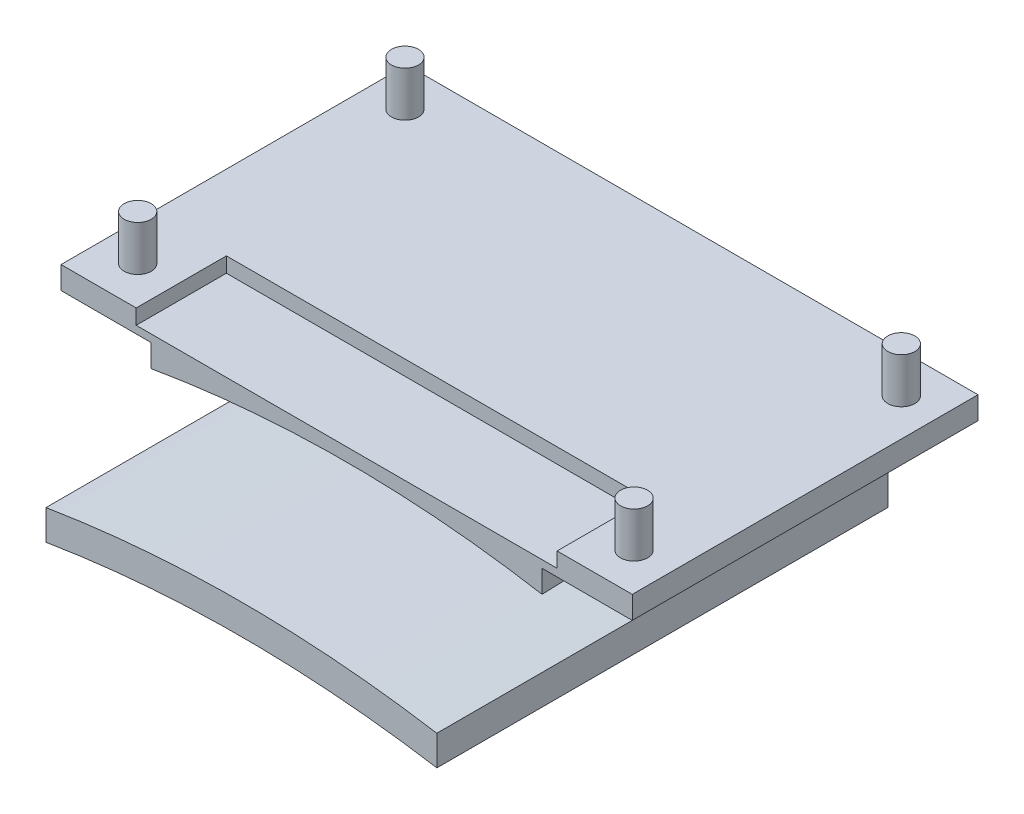
ISO-10303-21;
HEADER;
FILE_DESCRIPTION(('STEP AP214'),'2;1');
FILE_NAME('part.step','',(''),(''),'','','');
FILE_SCHEMA(('AUTOMOTIVE_DESIGN { 1 0 10303 214 1 1 1 1 }'));
ENDSEC;
DATA;
#1=APPLICATION_CONTEXT('core data for automotive mechanical design processes');
#2=APPLICATION_PROTOCOL_DEFINITION('international standard','automotive_design',2000,#1);
#3=PRODUCT_CONTEXT('',#1,'mechanical');
#4=PRODUCT('Part','Part','',(#3));
#5=PRODUCT_RELATED_PRODUCT_CATEGORY('part','',(#4));
#6=PRODUCT_DEFINITION_FORMATION('','',#4);
#7=PRODUCT_DEFINITION_CONTEXT('part definition',#1,'design');
#8=PRODUCT_DEFINITION('design','',#6,#7);
#9=PRODUCT_DEFINITION_SHAPE('','',#8);
#10=(LENGTH_UNIT() NAMED_UNIT(*) SI_UNIT(.MILLI.,.METRE.));
#11=(NAMED_UNIT(*) PLANE_ANGLE_UNIT() SI_UNIT($,.RADIAN.));
#12=(NAMED_UNIT(*) SI_UNIT($,.STERADIAN.) SOLID_ANGLE_UNIT());
#13=UNCERTAINTY_MEASURE_WITH_UNIT(LENGTH_MEASURE(1.E-05),#10,'distance_accuracy_value','');
#14=(GEOMETRIC_REPRESENTATION_CONTEXT(3) GLOBAL_UNCERTAINTY_ASSIGNED_CONTEXT((#13)) GLOBAL_UNIT_ASSIGNED_CONTEXT((#10,
#11,#12)) REPRESENTATION_CONTEXT('',''));
#15=CARTESIAN_POINT('',(0.,0.,0.));
#16=DIRECTION('',(0.,0.,1.));
#17=DIRECTION('',(1.,0.,0.));
#18=AXIS2_PLACEMENT_3D('',#15,#16,#17);
#19=CARTESIAN_POINT('',(-13.,9.5,8.));
#20=DIRECTION('',(0.,0.,-1.));
#21=DIRECTION('',(-1.,0.,0.));
#22=AXIS2_PLACEMENT_3D('',#19,#20,#21);
#23=PLANE('',#22);
#24=DIRECTION('',(0.,1.,0.));
#25=VECTOR('',#24,1.);
#26=CARTESIAN_POINT('',(-14.,8.5,8.));
#27=LINE('',#26,#25);
#28=CARTESIAN_POINT('',(-14.,8.5,8.));
#29=VERTEX_POINT('',#28);
#30=CARTESIAN_POINT('',(-14.,9.5,8.));
#31=VERTEX_POINT('',#30);
#32=EDGE_CURVE('E275',#29,#31,#27,.T.);
#33=ORIENTED_EDGE('',*,*,#32,.T.);
#34=DIRECTION('',(1.,0.,0.));
#35=VECTOR('',#34,1.);
#36=CARTESIAN_POINT('',(-13.,9.5,8.));
#37=LINE('',#36,#35);
#38=CARTESIAN_POINT('',(-19.,9.5,8.));
#39=VERTEX_POINT('',#38);
#40=EDGE_CURVE('E199',#39,#31,#37,.T.);
#41=ORIENTED_EDGE('',*,*,#40,.F.);
#42=DIRECTION('',(0.,1.,0.));
#43=VECTOR('',#42,1.);
#44=CARTESIAN_POINT('',(-19.,9.5,8.));
#45=LINE('',#44,#43);
#46=CARTESIAN_POINT('',(-19.,8.,8.));
#47=VERTEX_POINT('',#46);
#48=EDGE_CURVE('E332',#47,#39,#45,.T.);
#49=ORIENTED_EDGE('',*,*,#48,.F.);
#50=DIRECTION('',(1.,0.,0.));
#51=VECTOR('',#50,1.);
#52=CARTESIAN_POINT('',(-19.,8.,8.));
#53=LINE('',#52,#51);
#54=CARTESIAN_POINT('',(-13.,8.,8.));
#55=VERTEX_POINT('',#54);
#56=EDGE_CURVE('E338',#47,#55,#53,.T.);
#57=ORIENTED_EDGE('',*,*,#56,.T.);
#58=DIRECTION('',(0.,-1.,0.));
#59=VECTOR('',#58,1.);
#60=CARTESIAN_POINT('',(-13.,9.5,8.));
#61=LINE('',#60,#59);
#62=CARTESIAN_POINT('',(-13.,6.5,8.));
#63=VERTEX_POINT('',#62);
#64=EDGE_CURVE('E191',#55,#63,#61,.T.);
#65=ORIENTED_EDGE('',*,*,#64,.T.);
#66=CARTESIAN_POINT('',(0.,-68.3799038460921,8.));
#67=DIRECTION('',(0.,0.,1.));
#68=DIRECTION('',(-1.,0.,0.));
#69=AXIS2_PLACEMENT_3D('',#66,#67,#68);
#70=CIRCLE('',#69,76.);
#71=CARTESIAN_POINT('',(13.,6.5,8.00000000000001));
#72=VERTEX_POINT('',#71);
#73=EDGE_CURVE('E344',#72,#63,#70,.T.);
#74=ORIENTED_EDGE('',*,*,#73,.F.);
#75=DIRECTION('',(0.,-1.,0.));
#76=VECTOR('',#75,1.);
#77=CARTESIAN_POINT('',(13.,9.5,8.00000000000001));
#78=LINE('',#77,#76);
#79=CARTESIAN_POINT('',(13.,8.,8.00000000000001));
#80=VERTEX_POINT('',#79);
#81=EDGE_CURVE('E195',#80,#72,#78,.T.);
#82=ORIENTED_EDGE('',*,*,#81,.F.);
#83=DIRECTION('',(-1.,0.,0.));
#84=VECTOR('',#83,1.);
#85=CARTESIAN_POINT('',(19.,8.,8.));
#86=LINE('',#85,#84);
#87=CARTESIAN_POINT('',(19.,8.,8.));
#88=VERTEX_POINT('',#87);
#89=EDGE_CURVE('E57',#88,#80,#86,.T.);
#90=ORIENTED_EDGE('',*,*,#89,.F.);
#91=DIRECTION('',(0.,1.,0.));
#92=VECTOR('',#91,1.);
#93=CARTESIAN_POINT('',(19.,9.5,8.));
#94=LINE('',#93,#92);
#95=CARTESIAN_POINT('',(19.,9.5,8.));
#96=VERTEX_POINT('',#95);
#97=EDGE_CURVE('E318',#88,#96,#94,.T.);
#98=ORIENTED_EDGE('',*,*,#97,.T.);
#99=CARTESIAN_POINT('',(14.,9.5,8.00000000000001));
#100=VERTEX_POINT('',#99);
#101=EDGE_CURVE('E202',#100,#96,#37,.T.);
#102=ORIENTED_EDGE('',*,*,#101,.F.);
#103=DIRECTION('',(0.,1.,0.));
#104=VECTOR('',#103,1.);
#105=CARTESIAN_POINT('',(14.,8.5,8.));
#106=LINE('',#105,#104);
#107=CARTESIAN_POINT('',(14.,8.5,8.));
#108=VERTEX_POINT('',#107);
#109=EDGE_CURVE('E49',#108,#100,#106,.T.);
#110=ORIENTED_EDGE('',*,*,#109,.F.);
#111=DIRECTION('',(1.,0.,0.));
#112=VECTOR('',#111,1.);
#113=CARTESIAN_POINT('',(-14.,8.5,8.));
#114=LINE('',#113,#112);
#115=EDGE_CURVE('E273',#29,#108,#114,.T.);
#116=ORIENTED_EDGE('',*,*,#115,.F.);
#117=EDGE_LOOP('',(#33,#41,#49,#57,#65,#74,#82,#90,#98,#102,#110,#116));
#118=FACE_BOUND('',#117,.T.);
#119=ADVANCED_FACE('F33',(#118),#23,.F.);
#120=CARTESIAN_POINT('',(0.,9.5,0.));
#121=DIRECTION('',(0.,1.,0.));
#122=DIRECTION('',(0.,0.,1.));
#123=AXIS2_PLACEMENT_3D('',#120,#121,#122);
#124=PLANE('',#123);
#125=CARTESIAN_POINT('',(-16.5100000000001,9.5,-12.39));
#126=DIRECTION('',(0.,1.,0.));
#127=DIRECTION('',(0.,0.,1.));
#128=AXIS2_PLACEMENT_3D('',#125,#126,#127);
#129=CIRCLE('',#128,0.9);
#130=CARTESIAN_POINT('',(-16.5100000000001,9.5,-11.49));
#131=VERTEX_POINT('',#130);
#132=EDGE_CURVE('E288',#131,#131,#129,.T.);
#133=ORIENTED_EDGE('',*,*,#132,.F.);
#134=EDGE_LOOP('',(#133));
#135=FACE_BOUND('',#134,.T.);
#136=CARTESIAN_POINT('',(16.5099999999999,9.5,-12.39));
#137=DIRECTION('',(0.,1.,0.));
#138=DIRECTION('',(0.,0.,1.));
#139=AXIS2_PLACEMENT_3D('',#136,#137,#138);
#140=CIRCLE('',#139,0.9);
#141=CARTESIAN_POINT('',(16.5099999999999,9.5,-11.49));
#142=VERTEX_POINT('',#141);
#143=EDGE_CURVE('E292',#142,#142,#140,.T.);
#144=ORIENTED_EDGE('',*,*,#143,.F.);
#145=EDGE_LOOP('',(#144));
#146=FACE_BOUND('',#145,.T.);
#147=CARTESIAN_POINT('',(16.51,9.5,5.39));
#148=DIRECTION('',(0.,1.,0.));
#149=DIRECTION('',(0.,0.,1.));
#150=AXIS2_PLACEMENT_3D('',#147,#148,#149);
#151=CIRCLE('',#150,0.9);
#152=CARTESIAN_POINT('',(16.51,9.5,6.29));
#153=VERTEX_POINT('',#152);
#154=EDGE_CURVE('E298',#153,#153,#151,.T.);
#155=ORIENTED_EDGE('',*,*,#154,.F.);
#156=EDGE_LOOP('',(#155));
#157=FACE_BOUND('',#156,.T.);
#158=CARTESIAN_POINT('',(-16.51,9.5,5.39));
#159=DIRECTION('',(0.,1.,0.));
#160=DIRECTION('',(0.,0.,1.));
#161=AXIS2_PLACEMENT_3D('',#158,#159,#160);
#162=CIRCLE('',#161,0.9);
#163=CARTESIAN_POINT('',(-16.51,9.5,6.29));
#164=VERTEX_POINT('',#163);
#165=EDGE_CURVE('E304',#164,#164,#162,.T.);
#166=ORIENTED_EDGE('',*,*,#165,.F.);
#167=EDGE_LOOP('',(#166));
#168=FACE_BOUND('',#167,.T.);
#169=ORIENTED_EDGE('',*,*,#40,.T.);
#170=DIRECTION('',(0.,0.,-1.));
#171=VECTOR('',#170,1.);
#172=CARTESIAN_POINT('',(-14.,9.5,8.));
#173=LINE('',#172,#171);
#174=CARTESIAN_POINT('',(-14.,9.5,2.));
#175=VERTEX_POINT('',#174);
#176=EDGE_CURVE('E258',#31,#175,#173,.T.);
#177=ORIENTED_EDGE('',*,*,#176,.T.);
#178=DIRECTION('',(1.,0.,0.));
#179=VECTOR('',#178,1.);
#180=CARTESIAN_POINT('',(-14.,9.5,2.));
#181=LINE('',#180,#179);
#182=CARTESIAN_POINT('',(14.,9.5,2.));
#183=VERTEX_POINT('',#182);
#184=EDGE_CURVE('E261',#175,#183,#181,.T.);
#185=ORIENTED_EDGE('',*,*,#184,.T.);
#186=DIRECTION('',(0.,0.,-1.));
#187=VECTOR('',#186,1.);
#188=CARTESIAN_POINT('',(14.,9.5,8.));
#189=LINE('',#188,#187);
#190=EDGE_CURVE('E268',#100,#183,#189,.T.);
#191=ORIENTED_EDGE('',*,*,#190,.F.);
#192=ORIENTED_EDGE('',*,*,#101,.T.);
#193=DIRECTION('',(0.,0.,-1.));
#194=VECTOR('',#193,1.);
#195=CARTESIAN_POINT('',(19.,9.5,-15.));
#196=LINE('',#195,#194);
#197=CARTESIAN_POINT('',(19.,9.5,-15.));
#198=VERTEX_POINT('',#197);
#199=EDGE_CURVE('E315',#96,#198,#196,.T.);
#200=ORIENTED_EDGE('',*,*,#199,.T.);
#201=DIRECTION('',(-1.,0.,0.));
#202=VECTOR('',#201,1.);
#203=CARTESIAN_POINT('',(-13.,9.5,-15.));
#204=LINE('',#203,#202);
#205=CARTESIAN_POINT('',(-19.,9.5,-15.));
#206=VERTEX_POINT('',#205);
#207=EDGE_CURVE('E197',#198,#206,#204,.T.);
#208=ORIENTED_EDGE('',*,*,#207,.T.);
#209=DIRECTION('',(0.,0.,-1.));
#210=VECTOR('',#209,1.);
#211=CARTESIAN_POINT('',(-19.,9.5,-15.));
#212=LINE('',#211,#210);
#213=EDGE_CURVE('E335',#39,#206,#212,.T.);
#214=ORIENTED_EDGE('',*,*,#213,.F.);
#215=EDGE_LOOP('',(#169,#177,#185,#191,#192,#200,#208,#214));
#216=FACE_BOUND('',#215,.T.);
#217=ADVANCED_FACE('F227',(#135,#146,#157,#168,#216),#124,.T.);
#218=CARTESIAN_POINT('',(-13.,2.,15.));
#219=DIRECTION('',(1.,0.,0.));
#220=DIRECTION('',(0.,0.,-1.));
#221=AXIS2_PLACEMENT_3D('',#218,#219,#220);
#222=PLANE('',#221);
#223=DIRECTION('',(0.,0.,1.));
#224=VECTOR('',#223,1.);
#225=CARTESIAN_POINT('',(-13.,8.,-15.));
#226=LINE('',#225,#224);
#227=CARTESIAN_POINT('',(-13.,8.,-15.));
#228=VERTEX_POINT('',#227);
#229=EDGE_CURVE('E170',#228,#55,#226,.T.);
#230=ORIENTED_EDGE('',*,*,#229,.F.);
#231=DIRECTION('',(0.,-1.,0.));
#232=VECTOR('',#231,1.);
#233=CARTESIAN_POINT('',(-13.,2.,-15.));
#234=LINE('',#233,#232);
#235=CARTESIAN_POINT('',(-13.,0.,-15.));
#236=VERTEX_POINT('',#235);
#237=EDGE_CURVE('E42',#228,#236,#234,.T.);
#238=ORIENTED_EDGE('',*,*,#237,.T.);
#239=DIRECTION('',(0.,0.,1.));
#240=VECTOR('',#239,1.);
#241=CARTESIAN_POINT('',(-13.,0.,15.));
#242=LINE('',#241,#240);
#243=CARTESIAN_POINT('',(-13.,0.,15.));
#244=VERTEX_POINT('',#243);
#245=EDGE_CURVE('E148',#236,#244,#242,.T.);
#246=ORIENTED_EDGE('',*,*,#245,.T.);
#247=DIRECTION('',(0.,-1.,0.));
#248=VECTOR('',#247,1.);
#249=CARTESIAN_POINT('',(-13.,2.,15.));
#250=LINE('',#249,#248);
#251=CARTESIAN_POINT('',(-13.,2.,15.));
#252=VERTEX_POINT('',#251);
#253=EDGE_CURVE('E171',#252,#244,#250,.T.);
#254=ORIENTED_EDGE('',*,*,#253,.F.);
#255=DIRECTION('',(0.,0.,1.));
#256=VECTOR('',#255,1.);
#257=CARTESIAN_POINT('',(-13.,2.,15.));
#258=LINE('',#257,#256);
#259=CARTESIAN_POINT('',(-13.,2.,-12.));
#260=VERTEX_POINT('',#259);
#261=EDGE_CURVE('E176',#260,#252,#258,.T.);
#262=ORIENTED_EDGE('',*,*,#261,.F.);
#263=DIRECTION('',(0.,-1.,0.));
#264=VECTOR('',#263,1.);
#265=CARTESIAN_POINT('',(-13.,6.5,-12.));
#266=LINE('',#265,#264);
#267=CARTESIAN_POINT('',(-13.,7.20876543252182,-12.));
#268=VERTEX_POINT('',#267);
#269=EDGE_CURVE('E179',#268,#260,#266,.T.);
#270=ORIENTED_EDGE('',*,*,#269,.F.);
#271=CARTESIAN_POINT('',(-13.,8.46321190269024,-47.4111892310164));
#272=CARTESIAN_POINT('',(-13.,8.01531067880239,-34.7645607335864));
#273=CARTESIAN_POINT('',(-13.,7.56729467562959,-22.1179363033404));
#274=CARTESIAN_POINT('',(-13.,6.67103311071273,3.17530442282108));
#275=CARTESIAN_POINT('',(-13.,6.22278754896868,15.8219207187364));
#276=CARTESIAN_POINT('',(-13.,5.77442720793966,28.4685329474679));
#277=B_SPLINE_CURVE_WITH_KNOTS('',3,(#271,#272,#273,#274,#275,#276),.UNSPECIFIED.,.F.,.F.,(4,2,
4),(0.,37.9636727723907,75.9273455448929),.UNSPECIFIED.);
#278=EDGE_CURVE('E211',#268,#63,#277,.T.);
#279=ORIENTED_EDGE('',*,*,#278,.T.);
#280=ORIENTED_EDGE('',*,*,#64,.F.);
#281=EDGE_LOOP('',(#230,#238,#246,#254,#262,#270,#279,#280));
#282=FACE_BOUND('',#281,.T.);
#283=ADVANCED_FACE('F168',(#282),#222,.F.);
#284=CARTESIAN_POINT('',(13.,2.,15.));
#285=DIRECTION('',(-1.,0.,0.));
#286=DIRECTION('',(0.,0.,1.));
#287=AXIS2_PLACEMENT_3D('',#284,#285,#286);
#288=PLANE('',#287);
#289=DIRECTION('',(0.,-1.,0.));
#290=VECTOR('',#289,1.);
#291=CARTESIAN_POINT('',(13.,2.,-15.));
#292=LINE('',#291,#290);
#293=CARTESIAN_POINT('',(13.,8.,-15.));
#294=VERTEX_POINT('',#293);
#295=CARTESIAN_POINT('',(13.,0.,-15.));
#296=VERTEX_POINT('',#295);
#297=EDGE_CURVE('E11',#294,#296,#292,.T.);
#298=ORIENTED_EDGE('',*,*,#297,.F.);
#299=DIRECTION('',(0.,0.,1.));
#300=VECTOR('',#299,1.);
#301=CARTESIAN_POINT('',(13.,8.,-15.));
#302=LINE('',#301,#300);
#303=EDGE_CURVE('E254',#294,#80,#302,.T.);
#304=ORIENTED_EDGE('',*,*,#303,.T.);
#305=ORIENTED_EDGE('',*,*,#81,.T.);
#306=CARTESIAN_POINT('',(13.,5.77442720793966,28.4685329474679));
#307=CARTESIAN_POINT('',(13.,6.22278754896868,15.8219207187364));
#308=CARTESIAN_POINT('',(13.,6.67103311071273,3.17530442282107));
#309=CARTESIAN_POINT('',(13.,7.56729467562958,-22.1179363033404));
#310=CARTESIAN_POINT('',(13.,8.01531067880239,-34.7645607335864));
#311=CARTESIAN_POINT('',(13.,8.46321190269023,-47.4111892310164));
#312=B_SPLINE_CURVE_WITH_KNOTS('',3,(#306,#307,#308,#309,#310,#311),.UNSPECIFIED.,.F.,.F.,(4,2,
4),(0.,37.9636727725021,75.9273455448928),.UNSPECIFIED.);
#313=CARTESIAN_POINT('',(13.,7.20876543252182,-12.));
#314=VERTEX_POINT('',#313);
#315=EDGE_CURVE('E203',#72,#314,#312,.T.);
#316=ORIENTED_EDGE('',*,*,#315,.T.);
#317=DIRECTION('',(0.,-1.,0.));
#318=VECTOR('',#317,1.);
#319=CARTESIAN_POINT('',(13.,6.5,-12.));
#320=LINE('',#319,#318);
#321=CARTESIAN_POINT('',(13.,2.,-12.));
#322=VERTEX_POINT('',#321);
#323=EDGE_CURVE('E185',#314,#322,#320,.T.);
#324=ORIENTED_EDGE('',*,*,#323,.T.);
#325=DIRECTION('',(0.,0.,-1.));
#326=VECTOR('',#325,1.);
#327=CARTESIAN_POINT('',(13.,2.,15.));
#328=LINE('',#327,#326);
#329=CARTESIAN_POINT('',(13.,2.,15.));
#330=VERTEX_POINT('',#329);
#331=EDGE_CURVE('E157',#330,#322,#328,.T.);
#332=ORIENTED_EDGE('',*,*,#331,.F.);
#333=DIRECTION('',(0.,-1.,0.));
#334=VECTOR('',#333,1.);
#335=CARTESIAN_POINT('',(13.,2.,15.));
#336=LINE('',#335,#334);
#337=CARTESIAN_POINT('',(13.,0.,15.));
#338=VERTEX_POINT('',#337);
#339=EDGE_CURVE('E172',#330,#338,#336,.T.);
#340=ORIENTED_EDGE('',*,*,#339,.T.);
#341=DIRECTION('',(0.,0.,-1.));
#342=VECTOR('',#341,1.);
#343=CARTESIAN_POINT('',(13.,0.,15.));
#344=LINE('',#343,#342);
#345=EDGE_CURVE('E158',#338,#296,#344,.T.);
#346=ORIENTED_EDGE('',*,*,#345,.T.);
#347=EDGE_LOOP('',(#298,#304,#305,#316,#324,#332,#340,#346));
#348=FACE_BOUND('',#347,.T.);
#349=ADVANCED_FACE('F35',(#348),#288,.F.);
#350=CARTESIAN_POINT('',(-13.,2.,-15.));
#351=DIRECTION('',(0.,0.,1.));
#352=DIRECTION('',(1.,0.,0.));
#353=AXIS2_PLACEMENT_3D('',#350,#351,#352);
#354=PLANE('',#353);
#355=ORIENTED_EDGE('',*,*,#297,.T.);
#356=CARTESIAN_POINT('',(0.,-78.9366834874636,-15.));
#357=DIRECTION('',(0.,0.,1.));
#358=DIRECTION('',(1.,0.,0.));
#359=AXIS2_PLACEMENT_3D('',#356,#357,#358);
#360=CIRCLE('',#359,80.);
#361=EDGE_CURVE('E151',#236,#296,#360,.F.);
#362=ORIENTED_EDGE('',*,*,#361,.F.);
#363=ORIENTED_EDGE('',*,*,#237,.F.);
#364=DIRECTION('',(1.,0.,0.));
#365=VECTOR('',#364,1.);
#366=CARTESIAN_POINT('',(-19.,8.,-15.));
#367=LINE('',#366,#365);
#368=CARTESIAN_POINT('',(-19.,8.,-15.));
#369=VERTEX_POINT('',#368);
#370=EDGE_CURVE('E342',#369,#228,#367,.T.);
#371=ORIENTED_EDGE('',*,*,#370,.F.);
#372=DIRECTION('',(0.,-1.,0.));
#373=VECTOR('',#372,1.);
#374=CARTESIAN_POINT('',(-19.,9.5,-15.));
#375=LINE('',#374,#373);
#376=EDGE_CURVE('E327',#206,#369,#375,.T.);
#377=ORIENTED_EDGE('',*,*,#376,.F.);
#378=ORIENTED_EDGE('',*,*,#207,.F.);
#379=DIRECTION('',(0.,-1.,0.));
#380=VECTOR('',#379,1.);
#381=CARTESIAN_POINT('',(19.,9.5,-15.));
#382=LINE('',#381,#380);
#383=CARTESIAN_POINT('',(19.,8.,-15.));
#384=VERTEX_POINT('',#383);
#385=EDGE_CURVE('E312',#198,#384,#382,.T.);
#386=ORIENTED_EDGE('',*,*,#385,.T.);
#387=DIRECTION('',(-1.,0.,0.));
#388=VECTOR('',#387,1.);
#389=CARTESIAN_POINT('',(19.,8.,-15.));
#390=LINE('',#389,#388);
#391=EDGE_CURVE('E323',#384,#294,#390,.T.);
#392=ORIENTED_EDGE('',*,*,#391,.T.);
#393=EDGE_LOOP('',(#355,#362,#363,#371,#377,#378,#386,#392));
#394=FACE_BOUND('',#393,.T.);
#395=ADVANCED_FACE('F162',(#394),#354,.F.);
#396=CARTESIAN_POINT('',(-13.,2.,15.));
#397=DIRECTION('',(0.,0.,-1.));
#398=DIRECTION('',(-1.,0.,0.));
#399=AXIS2_PLACEMENT_3D('',#396,#397,#398);
#400=PLANE('',#399);
#401=ORIENTED_EDGE('',*,*,#253,.T.);
#402=CARTESIAN_POINT('',(0.,-78.9366834874636,15.));
#403=DIRECTION('',(0.,0.,1.));
#404=DIRECTION('',(1.,0.,0.));
#405=AXIS2_PLACEMENT_3D('',#402,#403,#404);
#406=CIRCLE('',#405,80.);
#407=EDGE_CURVE('E153',#338,#244,#406,.T.);
#408=ORIENTED_EDGE('',*,*,#407,.F.);
#409=ORIENTED_EDGE('',*,*,#339,.F.);
#410=CARTESIAN_POINT('',(0.,-76.9366834874635,15.));
#411=DIRECTION('',(0.,0.,-1.));
#412=DIRECTION('',(-1.,0.,0.));
#413=AXIS2_PLACEMENT_3D('',#410,#411,#412);
#414=CIRCLE('',#413,80.);
#415=EDGE_CURVE('E188',#252,#330,#414,.T.);
#416=ORIENTED_EDGE('',*,*,#415,.F.);
#417=EDGE_LOOP('',(#401,#408,#409,#416));
#418=FACE_BOUND('',#417,.T.);
#419=ADVANCED_FACE('F241',(#418),#400,.F.);
#420=CARTESIAN_POINT('',(13.,6.5,-12.));
#421=DIRECTION('',(0.,0.,-1.));
#422=DIRECTION('',(-1.,0.,0.));
#423=AXIS2_PLACEMENT_3D('',#420,#421,#422);
#424=PLANE('',#423);
#425=CARTESIAN_POINT('',(0.,-76.9366834874635,-12.));
#426=DIRECTION('',(0.,0.,-1.));
#427=DIRECTION('',(-1.,0.,0.));
#428=AXIS2_PLACEMENT_3D('',#425,#426,#427);
#429=CIRCLE('',#428,80.);
#430=EDGE_CURVE('E187',#260,#322,#429,.T.);
#431=ORIENTED_EDGE('',*,*,#430,.T.);
#432=ORIENTED_EDGE('',*,*,#323,.F.);
#433=CARTESIAN_POINT('',(0.,-68.3799038460921,-12.));
#434=DIRECTION('',(0.,0.,-1.));
#435=DIRECTION('',(-1.,0.,0.));
#436=AXIS2_PLACEMENT_3D('',#433,#434,#435);
#437=CIRCLE('',#436,76.698415389835);
#438=EDGE_CURVE('E346',#314,#268,#437,.F.);
#439=ORIENTED_EDGE('',*,*,#438,.T.);
#440=ORIENTED_EDGE('',*,*,#269,.T.);
#441=EDGE_LOOP('',(#431,#432,#439,#440));
#442=FACE_BOUND('',#441,.T.);
#443=ADVANCED_FACE('F237',(#442),#424,.F.);
#444=CARTESIAN_POINT('',(0.,-76.9366834874635,-12.));
#445=DIRECTION('',(0.,0.,1.));
#446=DIRECTION('',(1.,0.,0.));
#447=AXIS2_PLACEMENT_3D('',#444,#445,#446);
#448=CYLINDRICAL_SURFACE('',#447,80.);
#449=ORIENTED_EDGE('',*,*,#415,.T.);
#450=ORIENTED_EDGE('',*,*,#331,.T.);
#451=ORIENTED_EDGE('',*,*,#430,.F.);
#452=ORIENTED_EDGE('',*,*,#261,.T.);
#453=EDGE_LOOP('',(#449,#450,#451,#452));
#454=FACE_BOUND('',#453,.T.);
#455=ADVANCED_FACE('F224',(#454),#448,.T.);
#456=CARTESIAN_POINT('',(0.,-68.3799038460921,8.));
#457=DIRECTION('',(0.,0.,-1.));
#458=DIRECTION('',(-1.,0.,0.));
#459=AXIS2_PLACEMENT_3D('',#456,#457,#458);
#460=CONICAL_SURFACE('',#459,76.,0.0349065850398867);
#461=ORIENTED_EDGE('',*,*,#73,.T.);
#462=ORIENTED_EDGE('',*,*,#278,.F.);
#463=ORIENTED_EDGE('',*,*,#438,.F.);
#464=ORIENTED_EDGE('',*,*,#315,.F.);
#465=EDGE_LOOP('',(#461,#462,#463,#464));
#466=FACE_BOUND('',#465,.T.);
#467=ADVANCED_FACE('F218',(#466),#460,.F.);
#468=CARTESIAN_POINT('',(-19.,8.,-15.));
#469=DIRECTION('',(0.,1.,0.));
#470=DIRECTION('',(0.,0.,1.));
#471=AXIS2_PLACEMENT_3D('',#468,#469,#470);
#472=PLANE('',#471);
#473=ORIENTED_EDGE('',*,*,#229,.T.);
#474=ORIENTED_EDGE('',*,*,#56,.F.);
#475=DIRECTION('',(0.,0.,1.));
#476=VECTOR('',#475,1.);
#477=CARTESIAN_POINT('',(-19.,8.,-15.));
#478=LINE('',#477,#476);
#479=EDGE_CURVE('E330',#369,#47,#478,.T.);
#480=ORIENTED_EDGE('',*,*,#479,.F.);
#481=ORIENTED_EDGE('',*,*,#370,.T.);
#482=EDGE_LOOP('',(#473,#474,#480,#481));
#483=FACE_BOUND('',#482,.T.);
#484=ADVANCED_FACE('F223',(#483),#472,.F.);
#485=CARTESIAN_POINT('',(-19.,0.,0.));
#486=DIRECTION('',(-1.,0.,0.));
#487=DIRECTION('',(0.,0.,1.));
#488=AXIS2_PLACEMENT_3D('',#485,#486,#487);
#489=PLANE('',#488);
#490=ORIENTED_EDGE('',*,*,#376,.T.);
#491=ORIENTED_EDGE('',*,*,#479,.T.);
#492=ORIENTED_EDGE('',*,*,#48,.T.);
#493=ORIENTED_EDGE('',*,*,#213,.T.);
#494=EDGE_LOOP('',(#490,#491,#492,#493));
#495=FACE_BOUND('',#494,.T.);
#496=ADVANCED_FACE('F360',(#495),#489,.T.);
#497=CARTESIAN_POINT('',(19.,8.,-15.));
#498=DIRECTION('',(0.,-1.,0.));
#499=DIRECTION('',(0.,0.,-1.));
#500=AXIS2_PLACEMENT_3D('',#497,#498,#499);
#501=PLANE('',#500);
#502=ORIENTED_EDGE('',*,*,#303,.F.);
#503=ORIENTED_EDGE('',*,*,#391,.F.);
#504=DIRECTION('',(0.,0.,1.));
#505=VECTOR('',#504,1.);
#506=CARTESIAN_POINT('',(19.,8.,-15.));
#507=LINE('',#506,#505);
#508=EDGE_CURVE('E321',#384,#88,#507,.T.);
#509=ORIENTED_EDGE('',*,*,#508,.T.);
#510=ORIENTED_EDGE('',*,*,#89,.T.);
#511=EDGE_LOOP('',(#502,#503,#509,#510));
#512=FACE_BOUND('',#511,.T.);
#513=ADVANCED_FACE('F426',(#512),#501,.T.);
#514=CARTESIAN_POINT('',(19.,0.,0.));
#515=DIRECTION('',(1.,0.,0.));
#516=DIRECTION('',(0.,0.,1.));
#517=AXIS2_PLACEMENT_3D('',#514,#515,#516);
#518=PLANE('',#517);
#519=ORIENTED_EDGE('',*,*,#385,.F.);
#520=ORIENTED_EDGE('',*,*,#199,.F.);
#521=ORIENTED_EDGE('',*,*,#97,.F.);
#522=ORIENTED_EDGE('',*,*,#508,.F.);
#523=EDGE_LOOP('',(#519,#520,#521,#522));
#524=FACE_BOUND('',#523,.T.);
#525=ADVANCED_FACE('F367',(#524),#518,.T.);
#526=CARTESIAN_POINT('',(-16.51,12.5,5.39));
#527=DIRECTION('',(0.,-1.,0.));
#528=DIRECTION('',(0.,0.,-1.));
#529=AXIS2_PLACEMENT_3D('',#526,#527,#528);
#530=CYLINDRICAL_SURFACE('',#529,0.9);
#531=CARTESIAN_POINT('',(-16.51,12.5,5.39));
#532=DIRECTION('',(0.,1.,0.));
#533=DIRECTION('',(0.,0.,1.));
#534=AXIS2_PLACEMENT_3D('',#531,#532,#533);
#535=CIRCLE('',#534,0.9);
#536=CARTESIAN_POINT('',(-16.51,12.5,6.29));
#537=VERTEX_POINT('',#536);
#538=EDGE_CURVE('E307',#537,#537,#535,.T.);
#539=ORIENTED_EDGE('',*,*,#538,.F.);
#540=EDGE_LOOP('',(#539));
#541=FACE_BOUND('',#540,.T.);
#542=ORIENTED_EDGE('',*,*,#165,.T.);
#543=EDGE_LOOP('',(#542));
#544=FACE_BOUND('',#543,.T.);
#545=ADVANCED_FACE('F419',(#541,#544),#530,.T.);
#546=CARTESIAN_POINT('',(-16.51,12.5,5.39));
#547=DIRECTION('',(0.,1.,0.));
#548=DIRECTION('',(0.,0.,1.));
#549=AXIS2_PLACEMENT_3D('',#546,#547,#548);
#550=PLANE('',#549);
#551=ORIENTED_EDGE('',*,*,#538,.T.);
#552=EDGE_LOOP('',(#551));
#553=FACE_BOUND('',#552,.T.);
#554=ADVANCED_FACE('F415',(#553),#550,.T.);
#555=CARTESIAN_POINT('',(16.51,12.5,5.39));
#556=DIRECTION('',(0.,-1.,0.));
#557=DIRECTION('',(0.,0.,-1.));
#558=AXIS2_PLACEMENT_3D('',#555,#556,#557);
#559=CYLINDRICAL_SURFACE('',#558,0.9);
#560=CARTESIAN_POINT('',(16.51,12.5,5.39));
#561=DIRECTION('',(0.,1.,0.));
#562=DIRECTION('',(0.,0.,1.));
#563=AXIS2_PLACEMENT_3D('',#560,#561,#562);
#564=CIRCLE('',#563,0.9);
#565=CARTESIAN_POINT('',(16.51,12.5,6.29));
#566=VERTEX_POINT('',#565);
#567=EDGE_CURVE('E301',#566,#566,#564,.T.);
#568=ORIENTED_EDGE('',*,*,#567,.F.);
#569=EDGE_LOOP('',(#568));
#570=FACE_BOUND('',#569,.T.);
#571=ORIENTED_EDGE('',*,*,#154,.T.);
#572=EDGE_LOOP('',(#571));
#573=FACE_BOUND('',#572,.T.);
#574=ADVANCED_FACE('F411',(#570,#573),#559,.T.);
#575=CARTESIAN_POINT('',(16.51,12.5,5.39));
#576=DIRECTION('',(0.,1.,0.));
#577=DIRECTION('',(0.,0.,1.));
#578=AXIS2_PLACEMENT_3D('',#575,#576,#577);
#579=PLANE('',#578);
#580=ORIENTED_EDGE('',*,*,#567,.T.);
#581=EDGE_LOOP('',(#580));
#582=FACE_BOUND('',#581,.T.);
#583=ADVANCED_FACE('F407',(#582),#579,.T.);
#584=CARTESIAN_POINT('',(16.5099999999999,12.5,-12.39));
#585=DIRECTION('',(0.,-1.,0.));
#586=DIRECTION('',(0.,0.,-1.));
#587=AXIS2_PLACEMENT_3D('',#584,#585,#586);
#588=CYLINDRICAL_SURFACE('',#587,0.9);
#589=CARTESIAN_POINT('',(16.5099999999999,12.5,-12.39));
#590=DIRECTION('',(0.,1.,0.));
#591=DIRECTION('',(0.,0.,1.));
#592=AXIS2_PLACEMENT_3D('',#589,#590,#591);
#593=CIRCLE('',#592,0.9);
#594=CARTESIAN_POINT('',(16.5099999999999,12.5,-11.49));
#595=VERTEX_POINT('',#594);
#596=EDGE_CURVE('E295',#595,#595,#593,.T.);
#597=ORIENTED_EDGE('',*,*,#596,.F.);
#598=EDGE_LOOP('',(#597));
#599=FACE_BOUND('',#598,.T.);
#600=ORIENTED_EDGE('',*,*,#143,.T.);
#601=EDGE_LOOP('',(#600));
#602=FACE_BOUND('',#601,.T.);
#603=ADVANCED_FACE('F403',(#599,#602),#588,.T.);
#604=CARTESIAN_POINT('',(16.5099999999999,12.5,-12.39));
#605=DIRECTION('',(0.,1.,0.));
#606=DIRECTION('',(0.,0.,1.));
#607=AXIS2_PLACEMENT_3D('',#604,#605,#606);
#608=PLANE('',#607);
#609=ORIENTED_EDGE('',*,*,#596,.T.);
#610=EDGE_LOOP('',(#609));
#611=FACE_BOUND('',#610,.T.);
#612=ADVANCED_FACE('F399',(#611),#608,.T.);
#613=CARTESIAN_POINT('',(-16.5100000000001,12.5,-12.39));
#614=DIRECTION('',(0.,-1.,0.));
#615=DIRECTION('',(0.,0.,-1.));
#616=AXIS2_PLACEMENT_3D('',#613,#614,#615);
#617=CYLINDRICAL_SURFACE('',#616,0.9);
#618=CARTESIAN_POINT('',(-16.5100000000001,12.5,-12.39));
#619=DIRECTION('',(0.,1.,0.));
#620=DIRECTION('',(0.,0.,1.));
#621=AXIS2_PLACEMENT_3D('',#618,#619,#620);
#622=CIRCLE('',#621,0.9);
#623=CARTESIAN_POINT('',(-16.5100000000001,12.5,-11.49));
#624=VERTEX_POINT('',#623);
#625=EDGE_CURVE('E289',#624,#624,#622,.T.);
#626=ORIENTED_EDGE('',*,*,#625,.F.);
#627=EDGE_LOOP('',(#626));
#628=FACE_BOUND('',#627,.T.);
#629=ORIENTED_EDGE('',*,*,#132,.T.);
#630=EDGE_LOOP('',(#629));
#631=FACE_BOUND('',#630,.T.);
#632=ADVANCED_FACE('F395',(#628,#631),#617,.T.);
#633=CARTESIAN_POINT('',(-16.5100000000001,12.5,-12.39));
#634=DIRECTION('',(0.,1.,0.));
#635=DIRECTION('',(0.,0.,1.));
#636=AXIS2_PLACEMENT_3D('',#633,#634,#635);
#637=PLANE('',#636);
#638=ORIENTED_EDGE('',*,*,#625,.T.);
#639=EDGE_LOOP('',(#638));
#640=FACE_BOUND('',#639,.T.);
#641=ADVANCED_FACE('F392',(#640),#637,.T.);
#642=CARTESIAN_POINT('',(-14.,8.5,8.));
#643=DIRECTION('',(1.,0.,0.));
#644=DIRECTION('',(0.,0.,-1.));
#645=AXIS2_PLACEMENT_3D('',#642,#643,#644);
#646=PLANE('',#645);
#647=ORIENTED_EDGE('',*,*,#176,.F.);
#648=ORIENTED_EDGE('',*,*,#32,.F.);
#649=DIRECTION('',(0.,0.,-1.));
#650=VECTOR('',#649,1.);
#651=CARTESIAN_POINT('',(-14.,8.5,8.));
#652=LINE('',#651,#650);
#653=CARTESIAN_POINT('',(-14.,8.5,2.));
#654=VERTEX_POINT('',#653);
#655=EDGE_CURVE('E264',#29,#654,#652,.T.);
#656=ORIENTED_EDGE('',*,*,#655,.T.);
#657=DIRECTION('',(0.,1.,0.));
#658=VECTOR('',#657,1.);
#659=CARTESIAN_POINT('',(-14.,8.5,2.));
#660=LINE('',#659,#658);
#661=EDGE_CURVE('E285',#654,#175,#660,.T.);
#662=ORIENTED_EDGE('',*,*,#661,.T.);
#663=EDGE_LOOP('',(#647,#648,#656,#662));
#664=FACE_BOUND('',#663,.T.);
#665=ADVANCED_FACE('F375',(#664),#646,.T.);
#666=CARTESIAN_POINT('',(-14.,8.5,2.));
#667=DIRECTION('',(0.,0.,1.));
#668=DIRECTION('',(1.,0.,0.));
#669=AXIS2_PLACEMENT_3D('',#666,#667,#668);
#670=PLANE('',#669);
#671=ORIENTED_EDGE('',*,*,#184,.F.);
#672=ORIENTED_EDGE('',*,*,#661,.F.);
#673=DIRECTION('',(1.,0.,0.));
#674=VECTOR('',#673,1.);
#675=CARTESIAN_POINT('',(-14.,8.5,2.));
#676=LINE('',#675,#674);
#677=CARTESIAN_POINT('',(14.,8.5,2.));
#678=VERTEX_POINT('',#677);
#679=EDGE_CURVE('E267',#654,#678,#676,.T.);
#680=ORIENTED_EDGE('',*,*,#679,.T.);
#681=DIRECTION('',(0.,1.,0.));
#682=VECTOR('',#681,1.);
#683=CARTESIAN_POINT('',(14.,8.5,2.));
#684=LINE('',#683,#682);
#685=EDGE_CURVE('E283',#678,#183,#684,.T.);
#686=ORIENTED_EDGE('',*,*,#685,.T.);
#687=EDGE_LOOP('',(#671,#672,#680,#686));
#688=FACE_BOUND('',#687,.T.);
#689=ADVANCED_FACE('F377',(#688),#670,.T.);
#690=CARTESIAN_POINT('',(14.,8.5,8.));
#691=DIRECTION('',(1.,0.,0.));
#692=DIRECTION('',(0.,0.,-1.));
#693=AXIS2_PLACEMENT_3D('',#690,#691,#692);
#694=PLANE('',#693);
#695=ORIENTED_EDGE('',*,*,#190,.T.);
#696=ORIENTED_EDGE('',*,*,#685,.F.);
#697=DIRECTION('',(0.,0.,-1.));
#698=VECTOR('',#697,1.);
#699=CARTESIAN_POINT('',(14.,8.5,8.));
#700=LINE('',#699,#698);
#701=EDGE_CURVE('E270',#108,#678,#700,.T.);
#702=ORIENTED_EDGE('',*,*,#701,.F.);
#703=ORIENTED_EDGE('',*,*,#109,.T.);
#704=EDGE_LOOP('',(#695,#696,#702,#703));
#705=FACE_BOUND('',#704,.T.);
#706=ADVANCED_FACE('F379',(#705),#694,.F.);
#707=CARTESIAN_POINT('',(0.,8.5,0.));
#708=DIRECTION('',(0.,-1.,0.));
#709=DIRECTION('',(0.,0.,-1.));
#710=AXIS2_PLACEMENT_3D('',#707,#708,#709);
#711=PLANE('',#710);
#712=ORIENTED_EDGE('',*,*,#655,.F.);
#713=ORIENTED_EDGE('',*,*,#115,.T.);
#714=ORIENTED_EDGE('',*,*,#701,.T.);
#715=ORIENTED_EDGE('',*,*,#679,.F.);
#716=EDGE_LOOP('',(#712,#713,#714,#715));
#717=FACE_BOUND('',#716,.T.);
#718=ADVANCED_FACE('F372',(#717),#711,.F.);
#719=CARTESIAN_POINT('',(0.,-78.9366834874636,-15.001));
#720=DIRECTION('',(0.,0.,1.));
#721=DIRECTION('',(1.,0.,0.));
#722=AXIS2_PLACEMENT_3D('',#719,#720,#721);
#723=CYLINDRICAL_SURFACE('',#722,80.);
#724=ORIENTED_EDGE('',*,*,#361,.T.);
#725=ORIENTED_EDGE('',*,*,#345,.F.);
#726=ORIENTED_EDGE('',*,*,#407,.T.);
#727=ORIENTED_EDGE('',*,*,#245,.F.);
#728=EDGE_LOOP('',(#724,#725,#726,#727));
#729=FACE_BOUND('',#728,.T.);
#730=ADVANCED_FACE('F150',(#729),#723,.F.);
#731=CLOSED_SHELL('',(#119,#217,#283,#349,#395,#419,#443,#455,#467,#484,#496,#513,#525,#545,
#554,#574,#583,#603,#612,#632,#641,#665,#689,#706,#718,#730));
#732=MANIFOLD_SOLID_BREP('B2',#731);
#733=ADVANCED_BREP_SHAPE_REPRESENTATION('',(#18,#732),#14);
#734=SHAPE_DEFINITION_REPRESENTATION(#9,#733);
ENDSEC;
END-ISO-10303-21;
